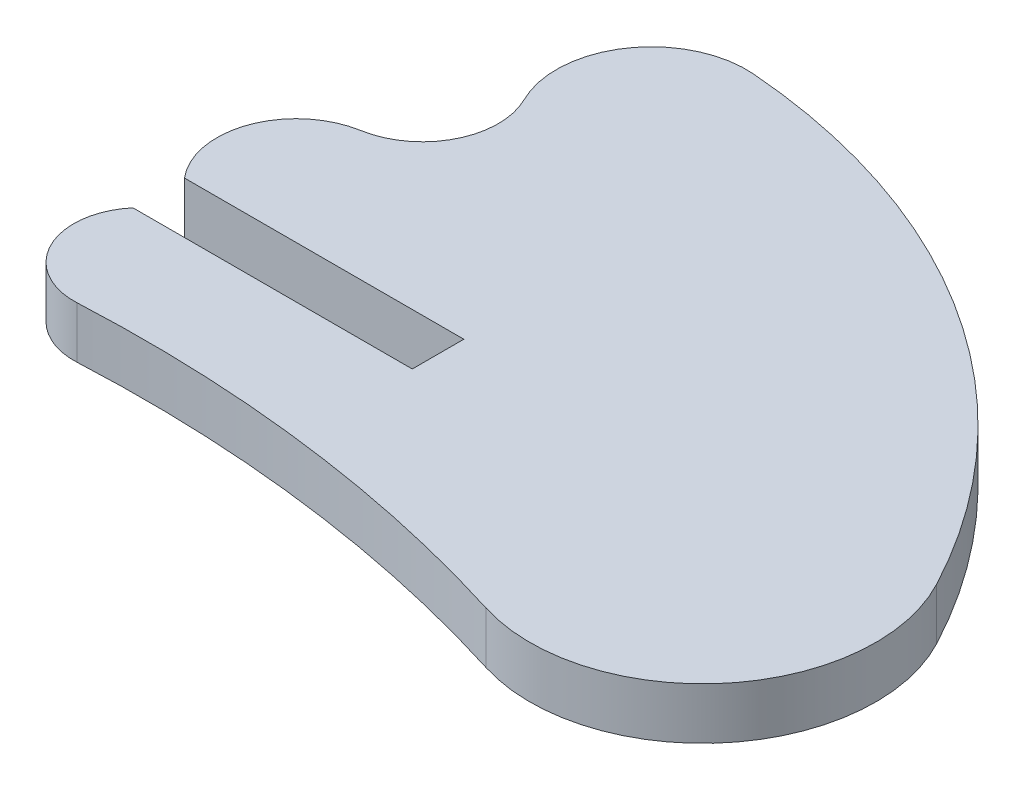
ISO-10303-21;
HEADER;
FILE_DESCRIPTION(('STEP AP214'),'2;1');
FILE_NAME('part.step','',(''),(''),'','','');
FILE_SCHEMA(('AUTOMOTIVE_DESIGN { 1 0 10303 214 1 1 1 1 }'));
ENDSEC;
DATA;
#1=APPLICATION_CONTEXT('core data for automotive mechanical design processes');
#2=APPLICATION_PROTOCOL_DEFINITION('international standard','automotive_design',2000,#1);
#3=PRODUCT_CONTEXT('',#1,'mechanical');
#4=PRODUCT('Part','Part','',(#3));
#5=PRODUCT_RELATED_PRODUCT_CATEGORY('part','',(#4));
#6=PRODUCT_DEFINITION_FORMATION('','',#4);
#7=PRODUCT_DEFINITION_CONTEXT('part definition',#1,'design');
#8=PRODUCT_DEFINITION('design','',#6,#7);
#9=PRODUCT_DEFINITION_SHAPE('','',#8);
#10=(LENGTH_UNIT() NAMED_UNIT(*) SI_UNIT(.MILLI.,.METRE.));
#11=(NAMED_UNIT(*) PLANE_ANGLE_UNIT() SI_UNIT($,.RADIAN.));
#12=(NAMED_UNIT(*) SI_UNIT($,.STERADIAN.) SOLID_ANGLE_UNIT());
#13=UNCERTAINTY_MEASURE_WITH_UNIT(LENGTH_MEASURE(1.E-05),#10,'distance_accuracy_value','');
#14=(GEOMETRIC_REPRESENTATION_CONTEXT(3) GLOBAL_UNCERTAINTY_ASSIGNED_CONTEXT((#13)) GLOBAL_UNIT_ASSIGNED_CONTEXT((#10,
#11,#12)) REPRESENTATION_CONTEXT('',''));
#15=CARTESIAN_POINT('',(0.,0.,0.));
#16=DIRECTION('',(0.,0.,1.));
#17=DIRECTION('',(1.,0.,0.));
#18=AXIS2_PLACEMENT_3D('',#15,#16,#17);
#19=CARTESIAN_POINT('',(-41743.4308736273,3.,-18228.9302134809));
#20=DIRECTION('',(0.,-1.,0.));
#21=DIRECTION('',(0.,0.,-1.));
#22=AXIS2_PLACEMENT_3D('',#19,#20,#21);
#23=CYLINDRICAL_SURFACE('',#22,10.0661919031034);
#24=CARTESIAN_POINT('',(-41743.4308736273,0.,-18228.9302134809));
#25=DIRECTION('',(0.,1.,0.));
#26=DIRECTION('',(0.,0.,1.));
#27=AXIS2_PLACEMENT_3D('',#24,#25,#26);
#28=CIRCLE('',#27,10.0661919031034);
#29=CARTESIAN_POINT('',(-41746.438604,0.,-18219.323873));
#30=VERTEX_POINT('',#29);
#31=CARTESIAN_POINT('',(-41734.53608,0.,-18233.643054));
#32=VERTEX_POINT('',#31);
#33=EDGE_CURVE('E143',#30,#32,#28,.T.);
#34=ORIENTED_EDGE('',*,*,#33,.T.);
#35=DIRECTION('',(0.,-1.,0.));
#36=VECTOR('',#35,1.);
#37=CARTESIAN_POINT('',(-41734.53608,3.,-18233.643054));
#38=LINE('',#37,#36);
#39=CARTESIAN_POINT('',(-41734.53608,3.,-18233.643054));
#40=VERTEX_POINT('',#39);
#41=EDGE_CURVE('E11',#40,#32,#38,.T.);
#42=ORIENTED_EDGE('',*,*,#41,.F.);
#43=CARTESIAN_POINT('',(-41743.4308736273,3.,-18228.9302134809));
#44=DIRECTION('',(0.,1.,0.));
#45=DIRECTION('',(0.,0.,1.));
#46=AXIS2_PLACEMENT_3D('',#43,#44,#45);
#47=CIRCLE('',#46,10.0661919031034);
#48=CARTESIAN_POINT('',(-41746.438604,3.,-18219.323873));
#49=VERTEX_POINT('',#48);
#50=EDGE_CURVE('E161',#49,#40,#47,.T.);
#51=ORIENTED_EDGE('',*,*,#50,.F.);
#52=DIRECTION('',(0.,-1.,0.));
#53=VECTOR('',#52,1.);
#54=CARTESIAN_POINT('',(-41746.438604,3.,-18219.323873));
#55=LINE('',#54,#53);
#56=EDGE_CURVE('E139',#49,#30,#55,.T.);
#57=ORIENTED_EDGE('',*,*,#56,.T.);
#58=EDGE_LOOP('',(#34,#42,#51,#57));
#59=FACE_BOUND('',#58,.T.);
#60=ADVANCED_FACE('F35',(#59),#23,.T.);
#61=CARTESIAN_POINT('',(-41768.5868768598,3.,-18215.6099919514));
#62=DIRECTION('',(0.,-1.,0.));
#63=DIRECTION('',(0.,0.,-1.));
#64=AXIS2_PLACEMENT_3D('',#61,#62,#63);
#65=CYLINDRICAL_SURFACE('',#64,38.5311314864987);
#66=CARTESIAN_POINT('',(-41768.5868768598,0.,-18215.6099919514));
#67=DIRECTION('',(0.,1.,0.));
#68=DIRECTION('',(0.,0.,1.));
#69=AXIS2_PLACEMENT_3D('',#66,#67,#68);
#70=CIRCLE('',#69,38.5311314864987);
#71=CARTESIAN_POINT('',(-41765.5841989999,0.,-18254.023948));
#72=VERTEX_POINT('',#71);
#73=EDGE_CURVE('E146',#32,#72,#70,.T.);
#74=ORIENTED_EDGE('',*,*,#73,.T.);
#75=DIRECTION('',(0.,-1.,0.));
#76=VECTOR('',#75,1.);
#77=CARTESIAN_POINT('',(-41765.5841989999,3.,-18254.023948));
#78=LINE('',#77,#76);
#79=CARTESIAN_POINT('',(-41765.5841989999,3.,-18254.023948));
#80=VERTEX_POINT('',#79);
#81=EDGE_CURVE('E43',#80,#72,#78,.T.);
#82=ORIENTED_EDGE('',*,*,#81,.F.);
#83=CARTESIAN_POINT('',(-41768.5868768598,3.,-18215.6099919514));
#84=DIRECTION('',(0.,1.,0.));
#85=DIRECTION('',(0.,0.,1.));
#86=AXIS2_PLACEMENT_3D('',#83,#84,#85);
#87=CIRCLE('',#86,38.5311314864987);
#88=EDGE_CURVE('E100',#40,#80,#87,.T.);
#89=ORIENTED_EDGE('',*,*,#88,.F.);
#90=ORIENTED_EDGE('',*,*,#41,.T.);
#91=EDGE_LOOP('',(#74,#82,#89,#90));
#92=FACE_BOUND('',#91,.T.);
#93=ADVANCED_FACE('F210',(#92),#65,.T.);
#94=CARTESIAN_POINT('',(-41766.0155015524,3.,-18248.5197140033));
#95=DIRECTION('',(0.,-1.,0.));
#96=DIRECTION('',(0.,0.,-1.));
#97=AXIS2_PLACEMENT_3D('',#94,#95,#96);
#98=CYLINDRICAL_SURFACE('',#97,5.52110621001445);
#99=CARTESIAN_POINT('',(-41766.0155015524,0.,-18248.5197140033));
#100=DIRECTION('',(0.,1.,0.));
#101=DIRECTION('',(0.,0.,1.));
#102=AXIS2_PLACEMENT_3D('',#99,#100,#101);
#103=CIRCLE('',#102,5.52110621001445);
#104=CARTESIAN_POINT('',(-41770.957559,0.,-18246.058275));
#105=VERTEX_POINT('',#104);
#106=EDGE_CURVE('E148',#72,#105,#103,.T.);
#107=ORIENTED_EDGE('',*,*,#106,.T.);
#108=DIRECTION('',(0.,-1.,0.));
#109=VECTOR('',#108,1.);
#110=CARTESIAN_POINT('',(-41770.957559,3.,-18246.058275));
#111=LINE('',#110,#109);
#112=CARTESIAN_POINT('',(-41770.957559,3.,-18246.058275));
#113=VERTEX_POINT('',#112);
#114=EDGE_CURVE('E174',#113,#105,#111,.T.);
#115=ORIENTED_EDGE('',*,*,#114,.F.);
#116=CARTESIAN_POINT('',(-41766.0155015524,3.,-18248.5197140033));
#117=DIRECTION('',(0.,1.,0.));
#118=DIRECTION('',(0.,0.,1.));
#119=AXIS2_PLACEMENT_3D('',#116,#117,#118);
#120=CIRCLE('',#119,5.52110621001445);
#121=EDGE_CURVE('E182',#80,#113,#120,.T.);
#122=ORIENTED_EDGE('',*,*,#121,.F.);
#123=ORIENTED_EDGE('',*,*,#81,.T.);
#124=EDGE_LOOP('',(#107,#115,#122,#123));
#125=FACE_BOUND('',#124,.T.);
#126=ADVANCED_FACE('F180',(#125),#98,.T.);
#127=CARTESIAN_POINT('',(-41774.905820974,3.,-18244.0926441048));
#128=DIRECTION('',(0.,-1.,0.));
#129=DIRECTION('',(0.,0.,-1.));
#130=AXIS2_PLACEMENT_3D('',#127,#128,#129);
#131=CYLINDRICAL_SURFACE('',#130,4.41049627950258);
#132=CARTESIAN_POINT('',(-41774.905820974,0.,-18244.0926441048));
#133=DIRECTION('',(0.,-1.,0.));
#134=DIRECTION('',(0.,0.,1.));
#135=AXIS2_PLACEMENT_3D('',#132,#133,#134);
#136=CIRCLE('',#135,4.41049627950258);
#137=CARTESIAN_POINT('',(-41774.154142,0.,-18239.746674));
#138=VERTEX_POINT('',#137);
#139=EDGE_CURVE('E150',#105,#138,#136,.T.);
#140=ORIENTED_EDGE('',*,*,#139,.T.);
#141=DIRECTION('',(0.,-1.,0.));
#142=VECTOR('',#141,1.);
#143=CARTESIAN_POINT('',(-41774.154142,3.,-18239.746674));
#144=LINE('',#143,#142);
#145=CARTESIAN_POINT('',(-41774.154142,3.,-18239.746674));
#146=VERTEX_POINT('',#145);
#147=EDGE_CURVE('E171',#146,#138,#144,.T.);
#148=ORIENTED_EDGE('',*,*,#147,.F.);
#149=CARTESIAN_POINT('',(-41774.905820974,3.,-18244.0926441048));
#150=DIRECTION('',(0.,-1.,0.));
#151=DIRECTION('',(0.,0.,1.));
#152=AXIS2_PLACEMENT_3D('',#149,#150,#151);
#153=CIRCLE('',#152,4.41049627950258);
#154=EDGE_CURVE('E200',#113,#146,#153,.T.);
#155=ORIENTED_EDGE('',*,*,#154,.F.);
#156=ORIENTED_EDGE('',*,*,#114,.T.);
#157=EDGE_LOOP('',(#140,#148,#155,#156));
#158=FACE_BOUND('',#157,.T.);
#159=ADVANCED_FACE('F191',(#158),#131,.F.);
#160=CARTESIAN_POINT('',(-41773.3720447747,3.,-18235.2044130894));
#161=DIRECTION('',(0.,-1.,0.));
#162=DIRECTION('',(0.,0.,-1.));
#163=AXIS2_PLACEMENT_3D('',#160,#161,#162);
#164=CYLINDRICAL_SURFACE('',#163,4.60910080710297);
#165=CARTESIAN_POINT('',(-41773.3720447747,0.,-18235.2044130894));
#166=DIRECTION('',(0.,1.,0.));
#167=DIRECTION('',(0.,0.,1.));
#168=AXIS2_PLACEMENT_3D('',#165,#166,#167);
#169=CIRCLE('',#168,4.60910080710297);
#170=CARTESIAN_POINT('',(-41776.886719,0.,-18232.222656));
#171=VERTEX_POINT('',#170);
#172=EDGE_CURVE('E152',#138,#171,#169,.T.);
#173=ORIENTED_EDGE('',*,*,#172,.T.);
#174=DIRECTION('',(0.,-1.,0.));
#175=VECTOR('',#174,1.);
#176=CARTESIAN_POINT('',(-41776.886719,3.,-18232.222656));
#177=LINE('',#176,#175);
#178=CARTESIAN_POINT('',(-41776.886719,3.,-18232.222656));
#179=VERTEX_POINT('',#178);
#180=EDGE_CURVE('E168',#179,#171,#177,.T.);
#181=ORIENTED_EDGE('',*,*,#180,.F.);
#182=CARTESIAN_POINT('',(-41773.3720447747,3.,-18235.2044130894));
#183=DIRECTION('',(0.,1.,0.));
#184=DIRECTION('',(0.,0.,1.));
#185=AXIS2_PLACEMENT_3D('',#182,#183,#184);
#186=CIRCLE('',#185,4.60910080710297);
#187=EDGE_CURVE('E197',#146,#179,#186,.T.);
#188=ORIENTED_EDGE('',*,*,#187,.F.);
#189=ORIENTED_EDGE('',*,*,#147,.T.);
#190=EDGE_LOOP('',(#173,#181,#188,#189));
#191=FACE_BOUND('',#190,.T.);
#192=ADVANCED_FACE('F195',(#191),#164,.T.);
#193=CARTESIAN_POINT('',(-41760.636719,3.,-18232.226562));
#194=DIRECTION('',(-0.000240369220975951,0.,-0.999999971111318));
#195=DIRECTION('',(-0.999999971111319,0.,0.000240369220975951));
#196=AXIS2_PLACEMENT_3D('',#193,#194,#195);
#197=PLANE('',#196);
#198=DIRECTION('',(0.999999971111318,0.,-0.000240369220975951));
#199=VECTOR('',#198,1.);
#200=CARTESIAN_POINT('',(-41760.636719,0.,-18232.226562));
#201=LINE('',#200,#199);
#202=CARTESIAN_POINT('',(-41760.636719,0.,-18232.226562));
#203=VERTEX_POINT('',#202);
#204=EDGE_CURVE('E154',#171,#203,#201,.T.);
#205=ORIENTED_EDGE('',*,*,#204,.T.);
#206=DIRECTION('',(0.,-1.,0.));
#207=VECTOR('',#206,1.);
#208=CARTESIAN_POINT('',(-41760.636719,3.,-18232.226562));
#209=LINE('',#208,#207);
#210=CARTESIAN_POINT('',(-41760.636719,3.,-18232.226562));
#211=VERTEX_POINT('',#210);
#212=EDGE_CURVE('E165',#211,#203,#209,.T.);
#213=ORIENTED_EDGE('',*,*,#212,.F.);
#214=DIRECTION('',(0.999999971111318,0.,-0.000240369220975951));
#215=VECTOR('',#214,1.);
#216=CARTESIAN_POINT('',(-41760.636719,3.,-18232.226562));
#217=LINE('',#216,#215);
#218=EDGE_CURVE('E199',#179,#211,#217,.T.);
#219=ORIENTED_EDGE('',*,*,#218,.F.);
#220=ORIENTED_EDGE('',*,*,#180,.T.);
#221=EDGE_LOOP('',(#205,#213,#219,#220));
#222=FACE_BOUND('',#221,.T.);
#223=ADVANCED_FACE('F222',(#222),#197,.F.);
#224=CARTESIAN_POINT('',(-41760.636719,3.,-18229.226562));
#225=DIRECTION('',(1.,0.,0.));
#226=DIRECTION('',(0.,0.,-1.));
#227=AXIS2_PLACEMENT_3D('',#224,#225,#226);
#228=PLANE('',#227);
#229=DIRECTION('',(0.,0.,1.));
#230=VECTOR('',#229,1.);
#231=CARTESIAN_POINT('',(-41760.636719,0.,-18229.226562));
#232=LINE('',#231,#230);
#233=CARTESIAN_POINT('',(-41760.636719,0.,-18229.226562));
#234=VERTEX_POINT('',#233);
#235=EDGE_CURVE('E156',#203,#234,#232,.T.);
#236=ORIENTED_EDGE('',*,*,#235,.T.);
#237=DIRECTION('',(0.,-1.,0.));
#238=VECTOR('',#237,1.);
#239=CARTESIAN_POINT('',(-41760.636719,3.,-18229.226562));
#240=LINE('',#239,#238);
#241=CARTESIAN_POINT('',(-41760.636719,3.,-18229.226562));
#242=VERTEX_POINT('',#241);
#243=EDGE_CURVE('E134',#242,#234,#240,.T.);
#244=ORIENTED_EDGE('',*,*,#243,.F.);
#245=DIRECTION('',(0.,0.,1.));
#246=VECTOR('',#245,1.);
#247=CARTESIAN_POINT('',(-41760.636719,3.,-18229.226562));
#248=LINE('',#247,#246);
#249=EDGE_CURVE('E125',#211,#242,#248,.T.);
#250=ORIENTED_EDGE('',*,*,#249,.F.);
#251=ORIENTED_EDGE('',*,*,#212,.T.);
#252=EDGE_LOOP('',(#236,#244,#250,#251));
#253=FACE_BOUND('',#252,.T.);
#254=ADVANCED_FACE('F225',(#253),#228,.F.);
#255=CARTESIAN_POINT('',(-41776.885247,3.,-18229.221443));
#256=DIRECTION('',(0.000315043906505128,0.,0.999999950373667));
#257=DIRECTION('',(0.999999950373667,0.,-0.000315043906505128));
#258=AXIS2_PLACEMENT_3D('',#255,#256,#257);
#259=PLANE('',#258);
#260=DIRECTION('',(-0.999999950373667,0.,0.000315043906505128));
#261=VECTOR('',#260,1.);
#262=CARTESIAN_POINT('',(-41776.885247,0.,-18229.221443));
#263=LINE('',#262,#261);
#264=CARTESIAN_POINT('',(-41776.885247,0.,-18229.221443));
#265=VERTEX_POINT('',#264);
#266=EDGE_CURVE('E133',#234,#265,#263,.T.);
#267=ORIENTED_EDGE('',*,*,#266,.T.);
#268=DIRECTION('',(0.,-1.,0.));
#269=VECTOR('',#268,1.);
#270=CARTESIAN_POINT('',(-41776.885247,3.,-18229.221443));
#271=LINE('',#270,#269);
#272=CARTESIAN_POINT('',(-41776.885247,3.,-18229.221443));
#273=VERTEX_POINT('',#272);
#274=EDGE_CURVE('E130',#273,#265,#271,.T.);
#275=ORIENTED_EDGE('',*,*,#274,.F.);
#276=DIRECTION('',(-0.999999950373667,0.,0.000315043906505128));
#277=VECTOR('',#276,1.);
#278=CARTESIAN_POINT('',(-41776.885247,3.,-18229.221443));
#279=LINE('',#278,#277);
#280=EDGE_CURVE('E119',#242,#273,#279,.T.);
#281=ORIENTED_EDGE('',*,*,#280,.F.);
#282=ORIENTED_EDGE('',*,*,#243,.T.);
#283=EDGE_LOOP('',(#267,#275,#281,#282));
#284=FACE_BOUND('',#283,.T.);
#285=ADVANCED_FACE('F131',(#284),#259,.F.);
#286=CARTESIAN_POINT('',(-41773.9179034733,3.,-18226.6990860745));
#287=DIRECTION('',(0.,-1.,0.));
#288=DIRECTION('',(0.,0.,-1.));
#289=AXIS2_PLACEMENT_3D('',#286,#287,#288);
#290=CYLINDRICAL_SURFACE('',#289,3.89453618097197);
#291=CARTESIAN_POINT('',(-41773.9179034733,0.,-18226.6990860745));
#292=DIRECTION('',(0.,1.,0.));
#293=DIRECTION('',(0.,0.,1.));
#294=AXIS2_PLACEMENT_3D('',#291,#292,#293);
#295=CIRCLE('',#294,3.89453618097197);
#296=CARTESIAN_POINT('',(-41773.7243610001,0.,-18222.809362));
#297=VERTEX_POINT('',#296);
#298=EDGE_CURVE('E86',#265,#297,#295,.T.);
#299=ORIENTED_EDGE('',*,*,#298,.T.);
#300=DIRECTION('',(0.,-1.,0.));
#301=VECTOR('',#300,1.);
#302=CARTESIAN_POINT('',(-41773.7243610001,3.,-18222.809362));
#303=LINE('',#302,#301);
#304=CARTESIAN_POINT('',(-41773.7243610001,3.,-18222.809362));
#305=VERTEX_POINT('',#304);
#306=EDGE_CURVE('E135',#305,#297,#303,.T.);
#307=ORIENTED_EDGE('',*,*,#306,.F.);
#308=CARTESIAN_POINT('',(-41773.9179034733,3.,-18226.6990860745));
#309=DIRECTION('',(0.,1.,0.));
#310=DIRECTION('',(0.,0.,1.));
#311=AXIS2_PLACEMENT_3D('',#308,#309,#310);
#312=CIRCLE('',#311,3.89453618097197);
#313=EDGE_CURVE('E123',#273,#305,#312,.T.);
#314=ORIENTED_EDGE('',*,*,#313,.F.);
#315=ORIENTED_EDGE('',*,*,#274,.T.);
#316=EDGE_LOOP('',(#299,#307,#314,#315));
#317=FACE_BOUND('',#316,.T.);
#318=ADVANCED_FACE('F137',(#317),#290,.T.);
#319=CARTESIAN_POINT('',(-41769.8593757966,3.,-18144.5214841018));
#320=DIRECTION('',(0.,-1.,0.));
#321=DIRECTION('',(0.,0.,-1.));
#322=AXIS2_PLACEMENT_3D('',#319,#320,#321);
#323=CYLINDRICAL_SURFACE('',#322,78.3832248406996);
#324=CARTESIAN_POINT('',(-41769.8593757966,0.,-18144.5214841018));
#325=DIRECTION('',(0.,-1.,0.));
#326=DIRECTION('',(0.,0.,1.));
#327=AXIS2_PLACEMENT_3D('',#324,#325,#326);
#328=CIRCLE('',#327,78.3832248406996);
#329=EDGE_CURVE('E92',#297,#30,#328,.T.);
#330=ORIENTED_EDGE('',*,*,#329,.T.);
#331=ORIENTED_EDGE('',*,*,#56,.F.);
#332=CARTESIAN_POINT('',(-41769.8593757966,3.,-18144.5214841018));
#333=DIRECTION('',(0.,-1.,0.));
#334=DIRECTION('',(0.,0.,1.));
#335=AXIS2_PLACEMENT_3D('',#332,#333,#334);
#336=CIRCLE('',#335,78.3832248406996);
#337=EDGE_CURVE('E51',#305,#49,#336,.T.);
#338=ORIENTED_EDGE('',*,*,#337,.F.);
#339=ORIENTED_EDGE('',*,*,#306,.T.);
#340=EDGE_LOOP('',(#330,#331,#338,#339));
#341=FACE_BOUND('',#340,.T.);
#342=ADVANCED_FACE('F234',(#341),#323,.F.);
#343=CARTESIAN_POINT('',(-41743.4308736273,3.,-18228.9302134809));
#344=DIRECTION('',(0.,1.,0.));
#345=DIRECTION('',(0.,0.,1.));
#346=AXIS2_PLACEMENT_3D('',#343,#344,#345);
#347=PLANE('',#346);
#348=ORIENTED_EDGE('',*,*,#50,.T.);
#349=ORIENTED_EDGE('',*,*,#88,.T.);
#350=ORIENTED_EDGE('',*,*,#121,.T.);
#351=ORIENTED_EDGE('',*,*,#154,.T.);
#352=ORIENTED_EDGE('',*,*,#187,.T.);
#353=ORIENTED_EDGE('',*,*,#218,.T.);
#354=ORIENTED_EDGE('',*,*,#249,.T.);
#355=ORIENTED_EDGE('',*,*,#280,.T.);
#356=ORIENTED_EDGE('',*,*,#313,.T.);
#357=ORIENTED_EDGE('',*,*,#337,.T.);
#358=EDGE_LOOP('',(#348,#349,#350,#351,#352,#353,#354,#355,#356,#357));
#359=FACE_BOUND('',#358,.T.);
#360=ADVANCED_FACE('F121',(#359),#347,.T.);
#361=CARTESIAN_POINT('',(-41743.4308736273,0.,-18228.9302134809));
#362=DIRECTION('',(0.,1.,0.));
#363=DIRECTION('',(0.,0.,1.));
#364=AXIS2_PLACEMENT_3D('',#361,#362,#363);
#365=PLANE('',#364);
#366=ORIENTED_EDGE('',*,*,#33,.F.);
#367=ORIENTED_EDGE('',*,*,#329,.F.);
#368=ORIENTED_EDGE('',*,*,#298,.F.);
#369=ORIENTED_EDGE('',*,*,#266,.F.);
#370=ORIENTED_EDGE('',*,*,#235,.F.);
#371=ORIENTED_EDGE('',*,*,#204,.F.);
#372=ORIENTED_EDGE('',*,*,#172,.F.);
#373=ORIENTED_EDGE('',*,*,#139,.F.);
#374=ORIENTED_EDGE('',*,*,#106,.F.);
#375=ORIENTED_EDGE('',*,*,#73,.F.);
#376=EDGE_LOOP('',(#366,#367,#368,#369,#370,#371,#372,#373,#374,#375));
#377=FACE_BOUND('',#376,.T.);
#378=ADVANCED_FACE('F186',(#377),#365,.F.);
#379=CLOSED_SHELL('',(#60,#93,#126,#159,#192,#223,#254,#285,#318,#342,#360,#378));
#380=MANIFOLD_SOLID_BREP('B2',#379);
#381=ADVANCED_BREP_SHAPE_REPRESENTATION('',(#18,#380),#14);
#382=SHAPE_DEFINITION_REPRESENTATION(#9,#381);
ENDSEC;
END-ISO-10303-21;
